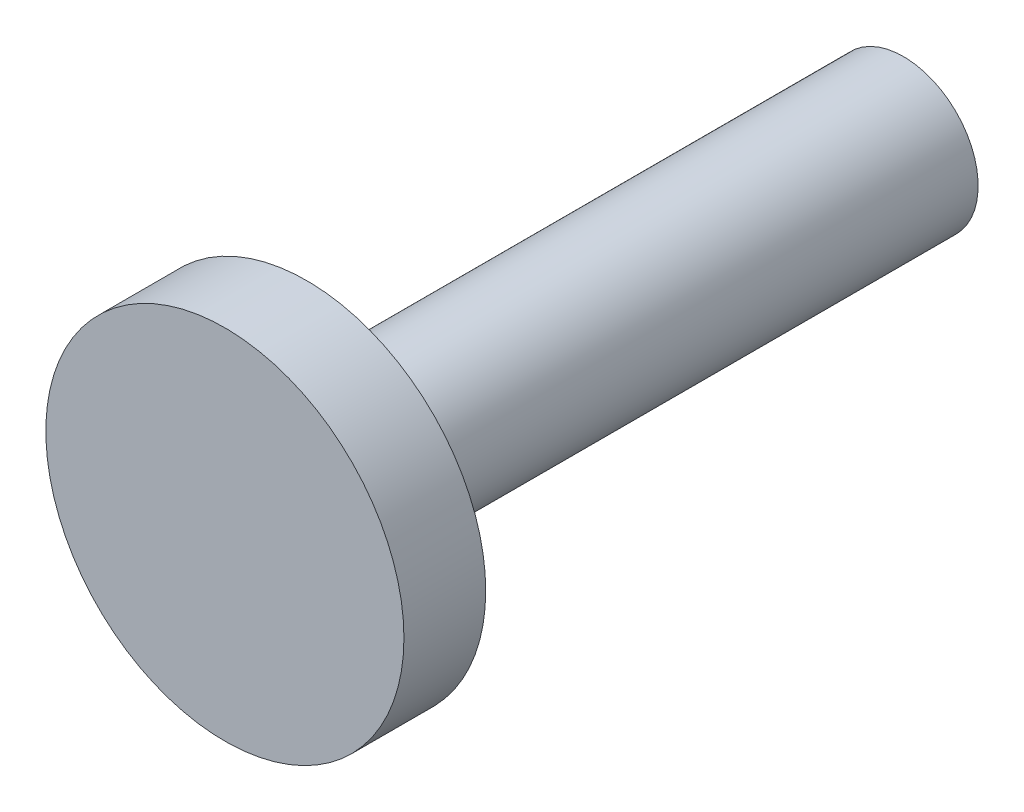
ISO-10303-21;
HEADER;
FILE_DESCRIPTION(('STEP AP214'),'2;1');
FILE_NAME('part.step','',(''),(''),'','','');
FILE_SCHEMA(('AUTOMOTIVE_DESIGN { 1 0 10303 214 1 1 1 1 }'));
ENDSEC;
DATA;
#1=APPLICATION_CONTEXT('core data for automotive mechanical design processes');
#2=APPLICATION_PROTOCOL_DEFINITION('international standard','automotive_design',2000,#1);
#3=PRODUCT_CONTEXT('',#1,'mechanical');
#4=PRODUCT('Part','Part','',(#3));
#5=PRODUCT_RELATED_PRODUCT_CATEGORY('part','',(#4));
#6=PRODUCT_DEFINITION_FORMATION('','',#4);
#7=PRODUCT_DEFINITION_CONTEXT('part definition',#1,'design');
#8=PRODUCT_DEFINITION('design','',#6,#7);
#9=PRODUCT_DEFINITION_SHAPE('','',#8);
#10=(LENGTH_UNIT() NAMED_UNIT(*) SI_UNIT(.MILLI.,.METRE.));
#11=(NAMED_UNIT(*) PLANE_ANGLE_UNIT() SI_UNIT($,.RADIAN.));
#12=(NAMED_UNIT(*) SI_UNIT($,.STERADIAN.) SOLID_ANGLE_UNIT());
#13=UNCERTAINTY_MEASURE_WITH_UNIT(LENGTH_MEASURE(1.E-05),#10,'distance_accuracy_value','');
#14=(GEOMETRIC_REPRESENTATION_CONTEXT(3) GLOBAL_UNCERTAINTY_ASSIGNED_CONTEXT((#13)) GLOBAL_UNIT_ASSIGNED_CONTEXT((#10,
#11,#12)) REPRESENTATION_CONTEXT('',''));
#15=CARTESIAN_POINT('',(0.,0.,0.));
#16=DIRECTION('',(0.,0.,1.));
#17=DIRECTION('',(1.,0.,0.));
#18=AXIS2_PLACEMENT_3D('',#15,#16,#17);
#19=CARTESIAN_POINT('',(0.,0.,1.37));
#20=DIRECTION('',(0.,0.,-1.));
#21=DIRECTION('',(-1.,0.,0.));
#22=AXIS2_PLACEMENT_3D('',#19,#20,#21);
#23=CYLINDRICAL_SURFACE('',#22,3.);
#24=CARTESIAN_POINT('',(0.,0.,1.37));
#25=DIRECTION('',(0.,0.,1.));
#26=DIRECTION('',(1.,0.,0.));
#27=AXIS2_PLACEMENT_3D('',#24,#25,#26);
#28=CIRCLE('',#27,3.);
#29=CARTESIAN_POINT('',(3.,0.,1.37));
#30=VERTEX_POINT('',#29);
#31=EDGE_CURVE('E40',#30,#30,#28,.T.);
#32=ORIENTED_EDGE('',*,*,#31,.F.);
#33=EDGE_LOOP('',(#32));
#34=FACE_BOUND('',#33,.T.);
#35=CARTESIAN_POINT('',(0.,0.,0.));
#36=DIRECTION('',(0.,0.,1.));
#37=DIRECTION('',(1.,0.,0.));
#38=AXIS2_PLACEMENT_3D('',#35,#36,#37);
#39=CIRCLE('',#38,3.);
#40=CARTESIAN_POINT('',(3.,0.,0.));
#41=VERTEX_POINT('',#40);
#42=EDGE_CURVE('E36',#41,#41,#39,.T.);
#43=ORIENTED_EDGE('',*,*,#42,.T.);
#44=EDGE_LOOP('',(#43));
#45=FACE_BOUND('',#44,.T.);
#46=ADVANCED_FACE('F33',(#34,#45),#23,.T.);
#47=CARTESIAN_POINT('',(0.,0.,1.37));
#48=DIRECTION('',(0.,0.,1.));
#49=DIRECTION('',(1.,0.,0.));
#50=AXIS2_PLACEMENT_3D('',#47,#48,#49);
#51=PLANE('',#50);
#52=ORIENTED_EDGE('',*,*,#31,.T.);
#53=EDGE_LOOP('',(#52));
#54=FACE_BOUND('',#53,.T.);
#55=ADVANCED_FACE('F57',(#54),#51,.T.);
#56=CARTESIAN_POINT('',(0.,0.,0.));
#57=DIRECTION('',(0.,0.,1.));
#58=DIRECTION('',(1.,0.,0.));
#59=AXIS2_PLACEMENT_3D('',#56,#57,#58);
#60=PLANE('',#59);
#61=CARTESIAN_POINT('',(0.,0.,0.));
#62=DIRECTION('',(0.,0.,-1.));
#63=DIRECTION('',(-1.,0.,0.));
#64=AXIS2_PLACEMENT_3D('',#61,#62,#63);
#65=CIRCLE('',#64,1.25);
#66=CARTESIAN_POINT('',(-1.25,0.,0.));
#67=VERTEX_POINT('',#66);
#68=EDGE_CURVE('E10',#67,#67,#65,.T.);
#69=ORIENTED_EDGE('',*,*,#68,.F.);
#70=EDGE_LOOP('',(#69));
#71=FACE_BOUND('',#70,.T.);
#72=ORIENTED_EDGE('',*,*,#42,.F.);
#73=EDGE_LOOP('',(#72));
#74=FACE_BOUND('',#73,.T.);
#75=ADVANCED_FACE('F54',(#71,#74),#60,.F.);
#76=CARTESIAN_POINT('',(0.,0.,-10.));
#77=DIRECTION('',(0.,0.,1.));
#78=DIRECTION('',(1.,0.,0.));
#79=AXIS2_PLACEMENT_3D('',#76,#77,#78);
#80=CYLINDRICAL_SURFACE('',#79,1.25);
#81=CARTESIAN_POINT('',(0.,0.,-10.));
#82=DIRECTION('',(0.,0.,-1.));
#83=DIRECTION('',(-1.,0.,0.));
#84=AXIS2_PLACEMENT_3D('',#81,#82,#83);
#85=CIRCLE('',#84,1.25);
#86=CARTESIAN_POINT('',(-1.25,0.,-10.));
#87=VERTEX_POINT('',#86);
#88=EDGE_CURVE('E46',#87,#87,#85,.T.);
#89=ORIENTED_EDGE('',*,*,#88,.F.);
#90=EDGE_LOOP('',(#89));
#91=FACE_BOUND('',#90,.T.);
#92=ORIENTED_EDGE('',*,*,#68,.T.);
#93=EDGE_LOOP('',(#92));
#94=FACE_BOUND('',#93,.T.);
#95=ADVANCED_FACE('F56',(#91,#94),#80,.T.);
#96=CARTESIAN_POINT('',(0.,0.,-10.));
#97=DIRECTION('',(0.,0.,-1.));
#98=DIRECTION('',(-1.,0.,0.));
#99=AXIS2_PLACEMENT_3D('',#96,#97,#98);
#100=PLANE('',#99);
#101=ORIENTED_EDGE('',*,*,#88,.T.);
#102=EDGE_LOOP('',(#101));
#103=FACE_BOUND('',#102,.T.);
#104=ADVANCED_FACE('F63',(#103),#100,.T.);
#105=CLOSED_SHELL('',(#46,#55,#75,#95,#104));
#106=MANIFOLD_SOLID_BREP('B2',#105);
#107=ADVANCED_BREP_SHAPE_REPRESENTATION('',(#18,#106),#14);
#108=SHAPE_DEFINITION_REPRESENTATION(#9,#107);
ENDSEC;
END-ISO-10303-21;
